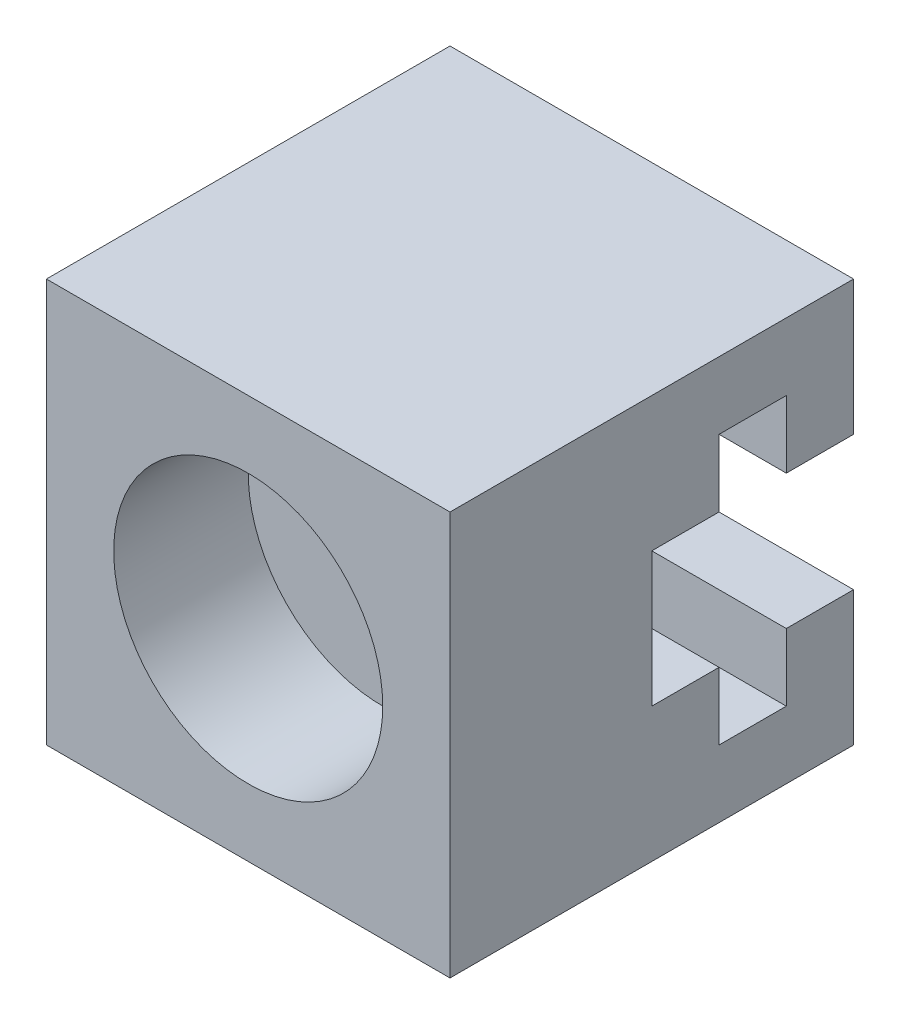
ISO-10303-21;
HEADER;
FILE_DESCRIPTION(('STEP AP214'),'2;1');
FILE_NAME('part.step','',(''),(''),'','','');
FILE_SCHEMA(('AUTOMOTIVE_DESIGN { 1 0 10303 214 1 1 1 1 }'));
ENDSEC;
DATA;
#1=APPLICATION_CONTEXT('core data for automotive mechanical design processes');
#2=APPLICATION_PROTOCOL_DEFINITION('international standard','automotive_design',2000,#1);
#3=PRODUCT_CONTEXT('',#1,'mechanical');
#4=PRODUCT('Part','Part','',(#3));
#5=PRODUCT_RELATED_PRODUCT_CATEGORY('part','',(#4));
#6=PRODUCT_DEFINITION_FORMATION('','',#4);
#7=PRODUCT_DEFINITION_CONTEXT('part definition',#1,'design');
#8=PRODUCT_DEFINITION('design','',#6,#7);
#9=PRODUCT_DEFINITION_SHAPE('','',#8);
#10=(LENGTH_UNIT() NAMED_UNIT(*) SI_UNIT(.MILLI.,.METRE.));
#11=(NAMED_UNIT(*) PLANE_ANGLE_UNIT() SI_UNIT($,.RADIAN.));
#12=(NAMED_UNIT(*) SI_UNIT($,.STERADIAN.) SOLID_ANGLE_UNIT());
#13=UNCERTAINTY_MEASURE_WITH_UNIT(LENGTH_MEASURE(1.E-05),#10,'distance_accuracy_value','');
#14=(GEOMETRIC_REPRESENTATION_CONTEXT(3) GLOBAL_UNCERTAINTY_ASSIGNED_CONTEXT((#13)) GLOBAL_UNIT_ASSIGNED_CONTEXT((#10,
#11,#12)) REPRESENTATION_CONTEXT('',''));
#15=CARTESIAN_POINT('',(0.,0.,0.));
#16=DIRECTION('',(0.,0.,1.));
#17=DIRECTION('',(1.,0.,0.));
#18=AXIS2_PLACEMENT_3D('',#15,#16,#17);
#19=CARTESIAN_POINT('',(75.,-25.,-75.));
#20=DIRECTION('',(0.,0.,1.));
#21=DIRECTION('',(1.,0.,0.));
#22=AXIS2_PLACEMENT_3D('',#19,#20,#21);
#23=PLANE('',#22);
#24=DIRECTION('',(-1.,0.,0.));
#25=VECTOR('',#24,1.);
#26=CARTESIAN_POINT('',(75.,-75.,-75.));
#27=LINE('',#26,#25);
#28=CARTESIAN_POINT('',(75.,-75.,-75.));
#29=VERTEX_POINT('',#28);
#30=CARTESIAN_POINT('',(-75.,-75.,-75.));
#31=VERTEX_POINT('',#30);
#32=EDGE_CURVE('E165',#29,#31,#27,.T.);
#33=ORIENTED_EDGE('',*,*,#32,.T.);
#34=DIRECTION('',(0.,1.,0.));
#35=VECTOR('',#34,1.);
#36=CARTESIAN_POINT('',(-75.,-25.,-75.));
#37=LINE('',#36,#35);
#38=CARTESIAN_POINT('',(-75.,-25.,-75.));
#39=VERTEX_POINT('',#38);
#40=EDGE_CURVE('E159',#31,#39,#37,.T.);
#41=ORIENTED_EDGE('',*,*,#40,.T.);
#42=DIRECTION('',(-1.,0.,0.));
#43=VECTOR('',#42,1.);
#44=CARTESIAN_POINT('',(75.,-25.,-75.));
#45=LINE('',#44,#43);
#46=CARTESIAN_POINT('',(75.,-25.,-75.));
#47=VERTEX_POINT('',#46);
#48=EDGE_CURVE('E11',#47,#39,#45,.T.);
#49=ORIENTED_EDGE('',*,*,#48,.F.);
#50=DIRECTION('',(0.,1.,0.));
#51=VECTOR('',#50,1.);
#52=CARTESIAN_POINT('',(75.,-25.,-75.));
#53=LINE('',#52,#51);
#54=EDGE_CURVE('E212',#29,#47,#53,.T.);
#55=ORIENTED_EDGE('',*,*,#54,.F.);
#56=EDGE_LOOP('',(#33,#41,#49,#55));
#57=FACE_BOUND('',#56,.T.);
#58=ADVANCED_FACE('F35',(#57),#23,.F.);
#59=CARTESIAN_POINT('',(75.,-25.,-50.));
#60=DIRECTION('',(0.,-1.,0.));
#61=DIRECTION('',(0.,0.,-1.));
#62=AXIS2_PLACEMENT_3D('',#59,#60,#61);
#63=PLANE('',#62);
#64=ORIENTED_EDGE('',*,*,#48,.T.);
#65=DIRECTION('',(0.,0.,1.));
#66=VECTOR('',#65,1.);
#67=CARTESIAN_POINT('',(-75.,-25.,-50.));
#68=LINE('',#67,#66);
#69=CARTESIAN_POINT('',(-75.,-25.,-50.));
#70=VERTEX_POINT('',#69);
#71=EDGE_CURVE('E149',#39,#70,#68,.T.);
#72=ORIENTED_EDGE('',*,*,#71,.T.);
#73=DIRECTION('',(-1.,0.,0.));
#74=VECTOR('',#73,1.);
#75=CARTESIAN_POINT('',(75.,-25.,-50.));
#76=LINE('',#75,#74);
#77=CARTESIAN_POINT('',(75.,-25.,-50.));
#78=VERTEX_POINT('',#77);
#79=EDGE_CURVE('E42',#78,#70,#76,.T.);
#80=ORIENTED_EDGE('',*,*,#79,.F.);
#81=DIRECTION('',(0.,0.,1.));
#82=VECTOR('',#81,1.);
#83=CARTESIAN_POINT('',(75.,-25.,-50.));
#84=LINE('',#83,#82);
#85=EDGE_CURVE('E150',#47,#78,#84,.T.);
#86=ORIENTED_EDGE('',*,*,#85,.F.);
#87=EDGE_LOOP('',(#64,#72,#80,#86));
#88=FACE_BOUND('',#87,.T.);
#89=ADVANCED_FACE('F147',(#88),#63,.F.);
#90=CARTESIAN_POINT('',(75.,-50.,-50.));
#91=DIRECTION('',(0.,0.,-1.));
#92=DIRECTION('',(-1.,0.,0.));
#93=AXIS2_PLACEMENT_3D('',#90,#91,#92);
#94=PLANE('',#93);
#95=ORIENTED_EDGE('',*,*,#79,.T.);
#96=DIRECTION('',(0.,-1.,0.));
#97=VECTOR('',#96,1.);
#98=CARTESIAN_POINT('',(-75.,-50.,-50.));
#99=LINE('',#98,#97);
#100=CARTESIAN_POINT('',(-75.,-50.,-50.));
#101=VERTEX_POINT('',#100);
#102=EDGE_CURVE('E163',#70,#101,#99,.T.);
#103=ORIENTED_EDGE('',*,*,#102,.T.);
#104=DIRECTION('',(-1.,0.,0.));
#105=VECTOR('',#104,1.);
#106=CARTESIAN_POINT('',(75.,-50.,-50.));
#107=LINE('',#106,#105);
#108=CARTESIAN_POINT('',(75.,-50.,-50.));
#109=VERTEX_POINT('',#108);
#110=EDGE_CURVE('E266',#109,#101,#107,.T.);
#111=ORIENTED_EDGE('',*,*,#110,.F.);
#112=DIRECTION('',(0.,-1.,0.));
#113=VECTOR('',#112,1.);
#114=CARTESIAN_POINT('',(75.,-50.,-50.));
#115=LINE('',#114,#113);
#116=EDGE_CURVE('E215',#78,#109,#115,.T.);
#117=ORIENTED_EDGE('',*,*,#116,.F.);
#118=EDGE_LOOP('',(#95,#103,#111,#117));
#119=FACE_BOUND('',#118,.T.);
#120=ADVANCED_FACE('F269',(#119),#94,.F.);
#121=CARTESIAN_POINT('',(75.,-50.,-25.));
#122=DIRECTION('',(0.,-1.,0.));
#123=DIRECTION('',(0.,0.,-1.));
#124=AXIS2_PLACEMENT_3D('',#121,#122,#123);
#125=PLANE('',#124);
#126=ORIENTED_EDGE('',*,*,#110,.T.);
#127=DIRECTION('',(0.,0.,1.));
#128=VECTOR('',#127,1.);
#129=CARTESIAN_POINT('',(-75.,-50.,-25.));
#130=LINE('',#129,#128);
#131=CARTESIAN_POINT('',(-75.,-50.,-25.));
#132=VERTEX_POINT('',#131);
#133=EDGE_CURVE('E174',#101,#132,#130,.T.);
#134=ORIENTED_EDGE('',*,*,#133,.T.);
#135=DIRECTION('',(-1.,0.,0.));
#136=VECTOR('',#135,1.);
#137=CARTESIAN_POINT('',(75.,-50.,-25.));
#138=LINE('',#137,#136);
#139=CARTESIAN_POINT('',(75.,-50.,-25.));
#140=VERTEX_POINT('',#139);
#141=EDGE_CURVE('E264',#140,#132,#138,.T.);
#142=ORIENTED_EDGE('',*,*,#141,.F.);
#143=DIRECTION('',(0.,0.,1.));
#144=VECTOR('',#143,1.);
#145=CARTESIAN_POINT('',(75.,-50.,-25.));
#146=LINE('',#145,#144);
#147=EDGE_CURVE('E217',#109,#140,#146,.T.);
#148=ORIENTED_EDGE('',*,*,#147,.F.);
#149=EDGE_LOOP('',(#126,#134,#142,#148));
#150=FACE_BOUND('',#149,.T.);
#151=ADVANCED_FACE('F277',(#150),#125,.F.);
#152=CARTESIAN_POINT('',(75.,-25.,-25.));
#153=DIRECTION('',(0.,0.,1.));
#154=DIRECTION('',(0.,-1.,0.));
#155=AXIS2_PLACEMENT_3D('',#152,#153,#154);
#156=PLANE('',#155);
#157=ORIENTED_EDGE('',*,*,#141,.T.);
#158=DIRECTION('',(0.,1.,0.));
#159=VECTOR('',#158,1.);
#160=CARTESIAN_POINT('',(-75.,-25.,-25.));
#161=LINE('',#160,#159);
#162=CARTESIAN_POINT('',(-75.,-25.,-25.));
#163=VERTEX_POINT('',#162);
#164=EDGE_CURVE('E177',#132,#163,#161,.T.);
#165=ORIENTED_EDGE('',*,*,#164,.T.);
#166=DIRECTION('',(-1.,0.,0.));
#167=VECTOR('',#166,1.);
#168=CARTESIAN_POINT('',(75.,-25.,-25.));
#169=LINE('',#168,#167);
#170=CARTESIAN_POINT('',(75.,-25.,-25.));
#171=VERTEX_POINT('',#170);
#172=EDGE_CURVE('E262',#171,#163,#169,.T.);
#173=ORIENTED_EDGE('',*,*,#172,.F.);
#174=DIRECTION('',(0.,1.,0.));
#175=VECTOR('',#174,1.);
#176=CARTESIAN_POINT('',(75.,-25.,-25.));
#177=LINE('',#176,#175);
#178=EDGE_CURVE('E219',#140,#171,#177,.T.);
#179=ORIENTED_EDGE('',*,*,#178,.F.);
#180=EDGE_LOOP('',(#157,#165,#173,#179));
#181=FACE_BOUND('',#180,.T.);
#182=ADVANCED_FACE('F280',(#181),#156,.F.);
#183=CARTESIAN_POINT('',(75.,-25.,0.));
#184=DIRECTION('',(0.,-1.,0.));
#185=DIRECTION('',(0.,0.,-1.));
#186=AXIS2_PLACEMENT_3D('',#183,#184,#185);
#187=PLANE('',#186);
#188=ORIENTED_EDGE('',*,*,#172,.T.);
#189=DIRECTION('',(0.,0.,1.));
#190=VECTOR('',#189,1.);
#191=CARTESIAN_POINT('',(-75.,-25.,0.));
#192=LINE('',#191,#190);
#193=CARTESIAN_POINT('',(-75.,-25.,0.));
#194=VERTEX_POINT('',#193);
#195=EDGE_CURVE('E180',#163,#194,#192,.T.);
#196=ORIENTED_EDGE('',*,*,#195,.T.);
#197=DIRECTION('',(-1.,0.,0.));
#198=VECTOR('',#197,1.);
#199=CARTESIAN_POINT('',(75.,-25.,0.));
#200=LINE('',#199,#198);
#201=CARTESIAN_POINT('',(75.,-25.,0.));
#202=VERTEX_POINT('',#201);
#203=EDGE_CURVE('E260',#202,#194,#200,.T.);
#204=ORIENTED_EDGE('',*,*,#203,.F.);
#205=DIRECTION('',(0.,0.,1.));
#206=VECTOR('',#205,1.);
#207=CARTESIAN_POINT('',(75.,-25.,0.));
#208=LINE('',#207,#206);
#209=EDGE_CURVE('E221',#171,#202,#208,.T.);
#210=ORIENTED_EDGE('',*,*,#209,.F.);
#211=EDGE_LOOP('',(#188,#196,#204,#210));
#212=FACE_BOUND('',#211,.T.);
#213=ADVANCED_FACE('F285',(#212),#187,.F.);
#214=CARTESIAN_POINT('',(75.,25.,0.));
#215=DIRECTION('',(0.,0.,1.));
#216=DIRECTION('',(0.,-1.,0.));
#217=AXIS2_PLACEMENT_3D('',#214,#215,#216);
#218=PLANE('',#217);
#219=ORIENTED_EDGE('',*,*,#203,.T.);
#220=DIRECTION('',(0.,1.,0.));
#221=VECTOR('',#220,1.);
#222=CARTESIAN_POINT('',(-75.,25.,0.));
#223=LINE('',#222,#221);
#224=CARTESIAN_POINT('',(-75.,25.,0.));
#225=VERTEX_POINT('',#224);
#226=EDGE_CURVE('E183',#194,#225,#223,.T.);
#227=ORIENTED_EDGE('',*,*,#226,.T.);
#228=DIRECTION('',(-1.,0.,0.));
#229=VECTOR('',#228,1.);
#230=CARTESIAN_POINT('',(75.,25.,0.));
#231=LINE('',#230,#229);
#232=CARTESIAN_POINT('',(75.,25.,0.));
#233=VERTEX_POINT('',#232);
#234=EDGE_CURVE('E258',#233,#225,#231,.T.);
#235=ORIENTED_EDGE('',*,*,#234,.F.);
#236=DIRECTION('',(0.,1.,0.));
#237=VECTOR('',#236,1.);
#238=CARTESIAN_POINT('',(75.,25.,0.));
#239=LINE('',#238,#237);
#240=EDGE_CURVE('E223',#202,#233,#239,.T.);
#241=ORIENTED_EDGE('',*,*,#240,.F.);
#242=EDGE_LOOP('',(#219,#227,#235,#241));
#243=FACE_BOUND('',#242,.T.);
#244=ADVANCED_FACE('F291',(#243),#218,.F.);
#245=CARTESIAN_POINT('',(75.,25.,-25.));
#246=DIRECTION('',(0.,1.,0.));
#247=DIRECTION('',(0.,0.,1.));
#248=AXIS2_PLACEMENT_3D('',#245,#246,#247);
#249=PLANE('',#248);
#250=ORIENTED_EDGE('',*,*,#234,.T.);
#251=DIRECTION('',(0.,0.,-1.));
#252=VECTOR('',#251,1.);
#253=CARTESIAN_POINT('',(-75.,25.,-25.));
#254=LINE('',#253,#252);
#255=CARTESIAN_POINT('',(-75.,25.,-25.));
#256=VERTEX_POINT('',#255);
#257=EDGE_CURVE('E186',#225,#256,#254,.T.);
#258=ORIENTED_EDGE('',*,*,#257,.T.);
#259=DIRECTION('',(-1.,0.,0.));
#260=VECTOR('',#259,1.);
#261=CARTESIAN_POINT('',(75.,25.,-25.));
#262=LINE('',#261,#260);
#263=CARTESIAN_POINT('',(75.,25.,-25.));
#264=VERTEX_POINT('',#263);
#265=EDGE_CURVE('E256',#264,#256,#262,.T.);
#266=ORIENTED_EDGE('',*,*,#265,.F.);
#267=DIRECTION('',(0.,0.,-1.));
#268=VECTOR('',#267,1.);
#269=CARTESIAN_POINT('',(75.,25.,-25.));
#270=LINE('',#269,#268);
#271=EDGE_CURVE('E225',#233,#264,#270,.T.);
#272=ORIENTED_EDGE('',*,*,#271,.F.);
#273=EDGE_LOOP('',(#250,#258,#266,#272));
#274=FACE_BOUND('',#273,.T.);
#275=ADVANCED_FACE('F295',(#274),#249,.F.);
#276=CARTESIAN_POINT('',(75.,50.,-25.));
#277=DIRECTION('',(0.,0.,1.));
#278=DIRECTION('',(0.,-1.,0.));
#279=AXIS2_PLACEMENT_3D('',#276,#277,#278);
#280=PLANE('',#279);
#281=ORIENTED_EDGE('',*,*,#265,.T.);
#282=DIRECTION('',(0.,1.,0.));
#283=VECTOR('',#282,1.);
#284=CARTESIAN_POINT('',(-75.,50.,-25.));
#285=LINE('',#284,#283);
#286=CARTESIAN_POINT('',(-75.,50.,-25.));
#287=VERTEX_POINT('',#286);
#288=EDGE_CURVE('E189',#256,#287,#285,.T.);
#289=ORIENTED_EDGE('',*,*,#288,.T.);
#290=DIRECTION('',(-1.,0.,0.));
#291=VECTOR('',#290,1.);
#292=CARTESIAN_POINT('',(75.,50.,-25.));
#293=LINE('',#292,#291);
#294=CARTESIAN_POINT('',(75.,50.,-25.));
#295=VERTEX_POINT('',#294);
#296=EDGE_CURVE('E254',#295,#287,#293,.T.);
#297=ORIENTED_EDGE('',*,*,#296,.F.);
#298=DIRECTION('',(0.,1.,0.));
#299=VECTOR('',#298,1.);
#300=CARTESIAN_POINT('',(75.,50.,-25.));
#301=LINE('',#300,#299);
#302=EDGE_CURVE('E227',#264,#295,#301,.T.);
#303=ORIENTED_EDGE('',*,*,#302,.F.);
#304=EDGE_LOOP('',(#281,#289,#297,#303));
#305=FACE_BOUND('',#304,.T.);
#306=ADVANCED_FACE('F300',(#305),#280,.F.);
#307=CARTESIAN_POINT('',(75.,50.,-50.));
#308=DIRECTION('',(0.,1.,0.));
#309=DIRECTION('',(0.,0.,1.));
#310=AXIS2_PLACEMENT_3D('',#307,#308,#309);
#311=PLANE('',#310);
#312=ORIENTED_EDGE('',*,*,#296,.T.);
#313=DIRECTION('',(0.,0.,-1.));
#314=VECTOR('',#313,1.);
#315=CARTESIAN_POINT('',(-75.,50.,-50.));
#316=LINE('',#315,#314);
#317=CARTESIAN_POINT('',(-75.,50.,-50.));
#318=VERTEX_POINT('',#317);
#319=EDGE_CURVE('E192',#287,#318,#316,.T.);
#320=ORIENTED_EDGE('',*,*,#319,.T.);
#321=DIRECTION('',(-1.,0.,0.));
#322=VECTOR('',#321,1.);
#323=CARTESIAN_POINT('',(75.,50.,-50.));
#324=LINE('',#323,#322);
#325=CARTESIAN_POINT('',(75.,50.,-50.));
#326=VERTEX_POINT('',#325);
#327=EDGE_CURVE('E252',#326,#318,#324,.T.);
#328=ORIENTED_EDGE('',*,*,#327,.F.);
#329=DIRECTION('',(0.,0.,-1.));
#330=VECTOR('',#329,1.);
#331=CARTESIAN_POINT('',(75.,50.,-50.));
#332=LINE('',#331,#330);
#333=EDGE_CURVE('E229',#295,#326,#332,.T.);
#334=ORIENTED_EDGE('',*,*,#333,.F.);
#335=EDGE_LOOP('',(#312,#320,#328,#334));
#336=FACE_BOUND('',#335,.T.);
#337=ADVANCED_FACE('F306',(#336),#311,.F.);
#338=CARTESIAN_POINT('',(75.,25.,-50.));
#339=DIRECTION('',(0.,0.,-1.));
#340=DIRECTION('',(-1.,0.,0.));
#341=AXIS2_PLACEMENT_3D('',#338,#339,#340);
#342=PLANE('',#341);
#343=ORIENTED_EDGE('',*,*,#327,.T.);
#344=DIRECTION('',(0.,-1.,0.));
#345=VECTOR('',#344,1.);
#346=CARTESIAN_POINT('',(-75.,25.,-50.));
#347=LINE('',#346,#345);
#348=CARTESIAN_POINT('',(-75.,25.,-50.));
#349=VERTEX_POINT('',#348);
#350=EDGE_CURVE('E195',#318,#349,#347,.T.);
#351=ORIENTED_EDGE('',*,*,#350,.T.);
#352=DIRECTION('',(-1.,0.,0.));
#353=VECTOR('',#352,1.);
#354=CARTESIAN_POINT('',(75.,25.,-50.));
#355=LINE('',#354,#353);
#356=CARTESIAN_POINT('',(75.,25.,-50.));
#357=VERTEX_POINT('',#356);
#358=EDGE_CURVE('E250',#357,#349,#355,.T.);
#359=ORIENTED_EDGE('',*,*,#358,.F.);
#360=DIRECTION('',(0.,-1.,0.));
#361=VECTOR('',#360,1.);
#362=CARTESIAN_POINT('',(75.,25.,-50.));
#363=LINE('',#362,#361);
#364=EDGE_CURVE('E231',#326,#357,#363,.T.);
#365=ORIENTED_EDGE('',*,*,#364,.F.);
#366=EDGE_LOOP('',(#343,#351,#359,#365));
#367=FACE_BOUND('',#366,.T.);
#368=ADVANCED_FACE('F310',(#367),#342,.F.);
#369=CARTESIAN_POINT('',(75.,25.,-75.));
#370=DIRECTION('',(0.,1.,0.));
#371=DIRECTION('',(0.,0.,1.));
#372=AXIS2_PLACEMENT_3D('',#369,#370,#371);
#373=PLANE('',#372);
#374=ORIENTED_EDGE('',*,*,#358,.T.);
#375=DIRECTION('',(0.,0.,-1.));
#376=VECTOR('',#375,1.);
#377=CARTESIAN_POINT('',(-75.,25.,-75.));
#378=LINE('',#377,#376);
#379=CARTESIAN_POINT('',(-75.,25.,-75.));
#380=VERTEX_POINT('',#379);
#381=EDGE_CURVE('E198',#349,#380,#378,.T.);
#382=ORIENTED_EDGE('',*,*,#381,.T.);
#383=DIRECTION('',(-1.,0.,0.));
#384=VECTOR('',#383,1.);
#385=CARTESIAN_POINT('',(75.,25.,-75.));
#386=LINE('',#385,#384);
#387=CARTESIAN_POINT('',(75.,25.,-75.));
#388=VERTEX_POINT('',#387);
#389=EDGE_CURVE('E248',#388,#380,#386,.T.);
#390=ORIENTED_EDGE('',*,*,#389,.F.);
#391=DIRECTION('',(0.,0.,-1.));
#392=VECTOR('',#391,1.);
#393=CARTESIAN_POINT('',(75.,25.,-75.));
#394=LINE('',#393,#392);
#395=EDGE_CURVE('E233',#357,#388,#394,.T.);
#396=ORIENTED_EDGE('',*,*,#395,.F.);
#397=EDGE_LOOP('',(#374,#382,#390,#396));
#398=FACE_BOUND('',#397,.T.);
#399=ADVANCED_FACE('F315',(#398),#373,.F.);
#400=CARTESIAN_POINT('',(75.,75.,-75.));
#401=DIRECTION('',(0.,0.,1.));
#402=DIRECTION('',(1.,0.,0.));
#403=AXIS2_PLACEMENT_3D('',#400,#401,#402);
#404=PLANE('',#403);
#405=ORIENTED_EDGE('',*,*,#389,.T.);
#406=DIRECTION('',(0.,1.,0.));
#407=VECTOR('',#406,1.);
#408=CARTESIAN_POINT('',(-75.,75.,-75.));
#409=LINE('',#408,#407);
#410=CARTESIAN_POINT('',(-75.,75.,-75.));
#411=VERTEX_POINT('',#410);
#412=EDGE_CURVE('E201',#380,#411,#409,.T.);
#413=ORIENTED_EDGE('',*,*,#412,.T.);
#414=DIRECTION('',(-1.,0.,0.));
#415=VECTOR('',#414,1.);
#416=CARTESIAN_POINT('',(75.,75.,-75.));
#417=LINE('',#416,#415);
#418=CARTESIAN_POINT('',(75.,75.,-75.));
#419=VERTEX_POINT('',#418);
#420=EDGE_CURVE('E246',#419,#411,#417,.T.);
#421=ORIENTED_EDGE('',*,*,#420,.F.);
#422=DIRECTION('',(0.,1.,0.));
#423=VECTOR('',#422,1.);
#424=CARTESIAN_POINT('',(75.,75.,-75.));
#425=LINE('',#424,#423);
#426=EDGE_CURVE('E235',#388,#419,#425,.T.);
#427=ORIENTED_EDGE('',*,*,#426,.F.);
#428=EDGE_LOOP('',(#405,#413,#421,#427));
#429=FACE_BOUND('',#428,.T.);
#430=ADVANCED_FACE('F321',(#429),#404,.F.);
#431=CARTESIAN_POINT('',(75.,75.,75.));
#432=DIRECTION('',(0.,-1.,0.));
#433=DIRECTION('',(0.,0.,-1.));
#434=AXIS2_PLACEMENT_3D('',#431,#432,#433);
#435=PLANE('',#434);
#436=ORIENTED_EDGE('',*,*,#420,.T.);
#437=DIRECTION('',(0.,0.,1.));
#438=VECTOR('',#437,1.);
#439=CARTESIAN_POINT('',(-75.,75.,75.));
#440=LINE('',#439,#438);
#441=CARTESIAN_POINT('',(-75.,75.,75.));
#442=VERTEX_POINT('',#441);
#443=EDGE_CURVE('E204',#411,#442,#440,.T.);
#444=ORIENTED_EDGE('',*,*,#443,.T.);
#445=DIRECTION('',(-1.,0.,0.));
#446=VECTOR('',#445,1.);
#447=CARTESIAN_POINT('',(75.,75.,75.));
#448=LINE('',#447,#446);
#449=CARTESIAN_POINT('',(75.,75.,75.));
#450=VERTEX_POINT('',#449);
#451=EDGE_CURVE('E244',#450,#442,#448,.T.);
#452=ORIENTED_EDGE('',*,*,#451,.F.);
#453=DIRECTION('',(0.,0.,1.));
#454=VECTOR('',#453,1.);
#455=CARTESIAN_POINT('',(75.,75.,75.));
#456=LINE('',#455,#454);
#457=EDGE_CURVE('E237',#419,#450,#456,.T.);
#458=ORIENTED_EDGE('',*,*,#457,.F.);
#459=EDGE_LOOP('',(#436,#444,#452,#458));
#460=FACE_BOUND('',#459,.T.);
#461=ADVANCED_FACE('F325',(#460),#435,.F.);
#462=CARTESIAN_POINT('',(75.,75.,75.));
#463=DIRECTION('',(0.,0.,-1.));
#464=DIRECTION('',(0.,1.,0.));
#465=AXIS2_PLACEMENT_3D('',#462,#463,#464);
#466=PLANE('',#465);
#467=CARTESIAN_POINT('',(0.,0.,75.));
#468=DIRECTION('',(0.,0.,1.));
#469=DIRECTION('',(1.,0.,0.));
#470=AXIS2_PLACEMENT_3D('',#467,#468,#469);
#471=CIRCLE('',#470,50.);
#472=CARTESIAN_POINT('',(50.,0.,75.));
#473=VERTEX_POINT('',#472);
#474=EDGE_CURVE('E169',#473,#473,#471,.T.);
#475=ORIENTED_EDGE('',*,*,#474,.F.);
#476=EDGE_LOOP('',(#475));
#477=FACE_BOUND('',#476,.T.);
#478=ORIENTED_EDGE('',*,*,#451,.T.);
#479=DIRECTION('',(0.,-1.,0.));
#480=VECTOR('',#479,1.);
#481=CARTESIAN_POINT('',(-75.,75.,75.));
#482=LINE('',#481,#480);
#483=CARTESIAN_POINT('',(-75.,-75.,75.));
#484=VERTEX_POINT('',#483);
#485=EDGE_CURVE('E207',#442,#484,#482,.T.);
#486=ORIENTED_EDGE('',*,*,#485,.T.);
#487=DIRECTION('',(-1.,0.,0.));
#488=VECTOR('',#487,1.);
#489=CARTESIAN_POINT('',(75.,-75.,75.));
#490=LINE('',#489,#488);
#491=CARTESIAN_POINT('',(75.,-75.,75.));
#492=VERTEX_POINT('',#491);
#493=EDGE_CURVE('E242',#492,#484,#490,.T.);
#494=ORIENTED_EDGE('',*,*,#493,.F.);
#495=DIRECTION('',(0.,-1.,0.));
#496=VECTOR('',#495,1.);
#497=CARTESIAN_POINT('',(75.,75.,75.));
#498=LINE('',#497,#496);
#499=EDGE_CURVE('E54',#450,#492,#498,.T.);
#500=ORIENTED_EDGE('',*,*,#499,.F.);
#501=EDGE_LOOP('',(#478,#486,#494,#500));
#502=FACE_BOUND('',#501,.T.);
#503=ADVANCED_FACE('F328',(#477,#502),#466,.F.);
#504=CARTESIAN_POINT('',(75.,-75.,75.));
#505=DIRECTION('',(0.,1.,0.));
#506=DIRECTION('',(0.,0.,1.));
#507=AXIS2_PLACEMENT_3D('',#504,#505,#506);
#508=PLANE('',#507);
#509=ORIENTED_EDGE('',*,*,#493,.T.);
#510=DIRECTION('',(0.,0.,-1.));
#511=VECTOR('',#510,1.);
#512=CARTESIAN_POINT('',(-75.,-75.,75.));
#513=LINE('',#512,#511);
#514=EDGE_CURVE('E210',#484,#31,#513,.T.);
#515=ORIENTED_EDGE('',*,*,#514,.T.);
#516=ORIENTED_EDGE('',*,*,#32,.F.);
#517=DIRECTION('',(0.,0.,-1.));
#518=VECTOR('',#517,1.);
#519=CARTESIAN_POINT('',(75.,-75.,75.));
#520=LINE('',#519,#518);
#521=EDGE_CURVE('E49',#492,#29,#520,.T.);
#522=ORIENTED_EDGE('',*,*,#521,.F.);
#523=EDGE_LOOP('',(#509,#515,#516,#522));
#524=FACE_BOUND('',#523,.T.);
#525=ADVANCED_FACE('F330',(#524),#508,.F.);
#526=CARTESIAN_POINT('',(75.,0.,0.));
#527=DIRECTION('',(1.,0.,0.));
#528=DIRECTION('',(0.,0.,-1.));
#529=AXIS2_PLACEMENT_3D('',#526,#527,#528);
#530=PLANE('',#529);
#531=ORIENTED_EDGE('',*,*,#54,.T.);
#532=ORIENTED_EDGE('',*,*,#85,.T.);
#533=ORIENTED_EDGE('',*,*,#116,.T.);
#534=ORIENTED_EDGE('',*,*,#147,.T.);
#535=ORIENTED_EDGE('',*,*,#178,.T.);
#536=ORIENTED_EDGE('',*,*,#209,.T.);
#537=ORIENTED_EDGE('',*,*,#240,.T.);
#538=ORIENTED_EDGE('',*,*,#271,.T.);
#539=ORIENTED_EDGE('',*,*,#302,.T.);
#540=ORIENTED_EDGE('',*,*,#333,.T.);
#541=ORIENTED_EDGE('',*,*,#364,.T.);
#542=ORIENTED_EDGE('',*,*,#395,.T.);
#543=ORIENTED_EDGE('',*,*,#426,.T.);
#544=ORIENTED_EDGE('',*,*,#457,.T.);
#545=ORIENTED_EDGE('',*,*,#499,.T.);
#546=ORIENTED_EDGE('',*,*,#521,.T.);
#547=EDGE_LOOP('',(#531,#532,#533,#534,#535,#536,#537,#538,#539,#540,#541,#542,#543,#544,#545,#546));
#548=FACE_BOUND('',#547,.T.);
#549=ADVANCED_FACE('F272',(#548),#530,.T.);
#550=CARTESIAN_POINT('',(-75.,0.,0.));
#551=DIRECTION('',(1.,0.,0.));
#552=DIRECTION('',(0.,0.,-1.));
#553=AXIS2_PLACEMENT_3D('',#550,#551,#552);
#554=PLANE('',#553);
#555=ORIENTED_EDGE('',*,*,#40,.F.);
#556=ORIENTED_EDGE('',*,*,#514,.F.);
#557=ORIENTED_EDGE('',*,*,#485,.F.);
#558=ORIENTED_EDGE('',*,*,#443,.F.);
#559=ORIENTED_EDGE('',*,*,#412,.F.);
#560=ORIENTED_EDGE('',*,*,#381,.F.);
#561=ORIENTED_EDGE('',*,*,#350,.F.);
#562=ORIENTED_EDGE('',*,*,#319,.F.);
#563=ORIENTED_EDGE('',*,*,#288,.F.);
#564=ORIENTED_EDGE('',*,*,#257,.F.);
#565=ORIENTED_EDGE('',*,*,#226,.F.);
#566=ORIENTED_EDGE('',*,*,#195,.F.);
#567=ORIENTED_EDGE('',*,*,#164,.F.);
#568=ORIENTED_EDGE('',*,*,#133,.F.);
#569=ORIENTED_EDGE('',*,*,#102,.F.);
#570=ORIENTED_EDGE('',*,*,#71,.F.);
#571=EDGE_LOOP('',(#555,#556,#557,#558,#559,#560,#561,#562,#563,#564,#565,#566,#567,#568,#569,#570));
#572=FACE_BOUND('',#571,.T.);
#573=ADVANCED_FACE('F157',(#572),#554,.F.);
#574=CARTESIAN_POINT('',(0.,0.,25.));
#575=DIRECTION('',(0.,0.,1.));
#576=DIRECTION('',(1.,0.,0.));
#577=AXIS2_PLACEMENT_3D('',#574,#575,#576);
#578=CYLINDRICAL_SURFACE('',#577,50.);
#579=CARTESIAN_POINT('',(0.,0.,25.));
#580=DIRECTION('',(0.,0.,1.));
#581=DIRECTION('',(1.,0.,0.));
#582=AXIS2_PLACEMENT_3D('',#579,#580,#581);
#583=CIRCLE('',#582,50.);
#584=CARTESIAN_POINT('',(50.,0.,25.));
#585=VERTEX_POINT('',#584);
#586=EDGE_CURVE('E166',#585,#585,#583,.T.);
#587=ORIENTED_EDGE('',*,*,#586,.F.);
#588=EDGE_LOOP('',(#587));
#589=FACE_BOUND('',#588,.T.);
#590=ORIENTED_EDGE('',*,*,#474,.T.);
#591=EDGE_LOOP('',(#590));
#592=FACE_BOUND('',#591,.T.);
#593=ADVANCED_FACE('F389',(#589,#592),#578,.F.);
#594=CARTESIAN_POINT('',(0.,0.,25.));
#595=DIRECTION('',(0.,0.,1.));
#596=DIRECTION('',(1.,0.,0.));
#597=AXIS2_PLACEMENT_3D('',#594,#595,#596);
#598=PLANE('',#597);
#599=ORIENTED_EDGE('',*,*,#586,.T.);
#600=EDGE_LOOP('',(#599));
#601=FACE_BOUND('',#600,.T.);
#602=ADVANCED_FACE('F394',(#601),#598,.T.);
#603=CLOSED_SHELL('',(#58,#89,#120,#151,#182,#213,#244,#275,#306,#337,#368,#399,#430,#461,#503,
#525,#549,#573,#593,#602));
#604=MANIFOLD_SOLID_BREP('B2',#603);
#605=ADVANCED_BREP_SHAPE_REPRESENTATION('',(#18,#604),#14);
#606=SHAPE_DEFINITION_REPRESENTATION(#9,#605);
ENDSEC;
END-ISO-10303-21;
